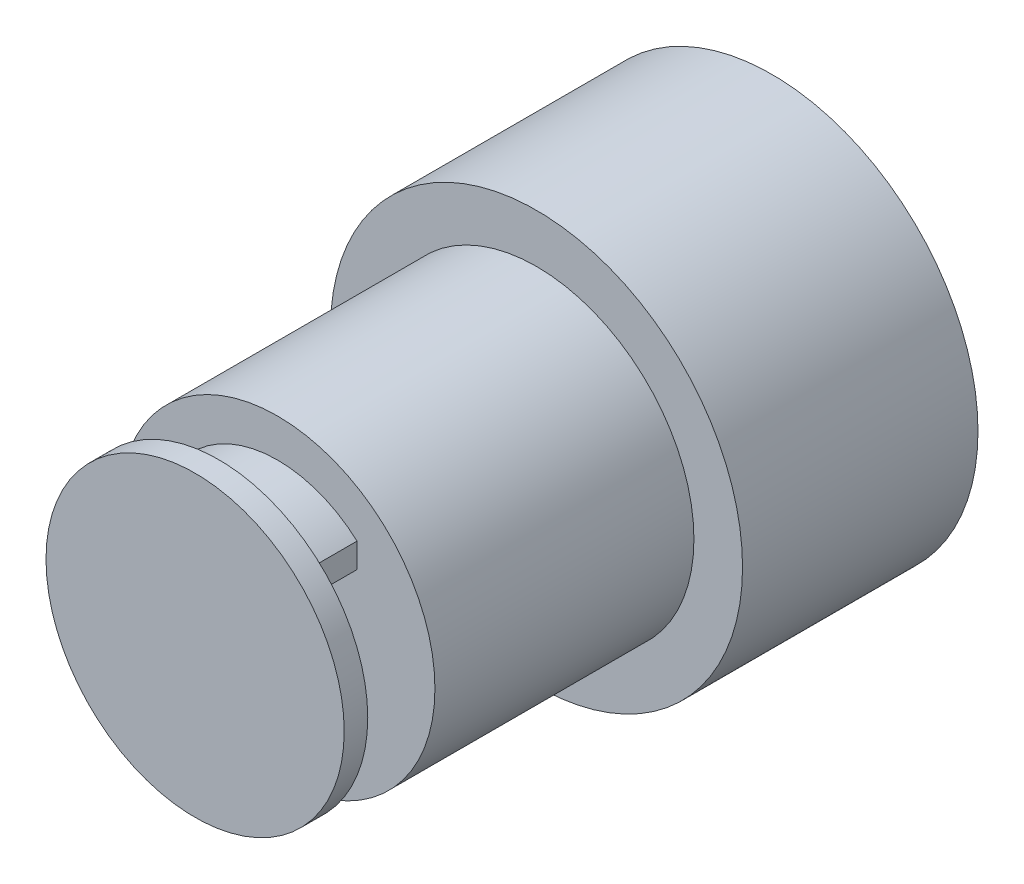
ISO-10303-21;
HEADER;
FILE_DESCRIPTION(('STEP AP214'),'2;1');
FILE_NAME('part.step','',(''),(''),'','','');
FILE_SCHEMA(('AUTOMOTIVE_DESIGN { 1 0 10303 214 1 1 1 1 }'));
ENDSEC;
DATA;
#1=APPLICATION_CONTEXT('core data for automotive mechanical design processes');
#2=APPLICATION_PROTOCOL_DEFINITION('international standard','automotive_design',2000,#1);
#3=PRODUCT_CONTEXT('',#1,'mechanical');
#4=PRODUCT('Part','Part','',(#3));
#5=PRODUCT_RELATED_PRODUCT_CATEGORY('part','',(#4));
#6=PRODUCT_DEFINITION_FORMATION('','',#4);
#7=PRODUCT_DEFINITION_CONTEXT('part definition',#1,'design');
#8=PRODUCT_DEFINITION('design','',#6,#7);
#9=PRODUCT_DEFINITION_SHAPE('','',#8);
#10=(LENGTH_UNIT() NAMED_UNIT(*) SI_UNIT(.MILLI.,.METRE.));
#11=(NAMED_UNIT(*) PLANE_ANGLE_UNIT() SI_UNIT($,.RADIAN.));
#12=(NAMED_UNIT(*) SI_UNIT($,.STERADIAN.) SOLID_ANGLE_UNIT());
#13=UNCERTAINTY_MEASURE_WITH_UNIT(LENGTH_MEASURE(1.E-05),#10,'distance_accuracy_value','');
#14=(GEOMETRIC_REPRESENTATION_CONTEXT(3) GLOBAL_UNCERTAINTY_ASSIGNED_CONTEXT((#13)) GLOBAL_UNIT_ASSIGNED_CONTEXT((#10,
#11,#12)) REPRESENTATION_CONTEXT('',''));
#15=CARTESIAN_POINT('',(0.,0.,0.));
#16=DIRECTION('',(0.,0.,1.));
#17=DIRECTION('',(1.,0.,0.));
#18=AXIS2_PLACEMENT_3D('',#15,#16,#17);
#19=CARTESIAN_POINT('',(0.,0.,0.));
#20=DIRECTION('',(0.,0.,1.));
#21=DIRECTION('',(1.,0.,0.));
#22=AXIS2_PLACEMENT_3D('',#19,#20,#21);
#23=PLANE('',#22);
#24=CARTESIAN_POINT('',(0.,0.,0.));
#25=DIRECTION('',(0.,0.,1.));
#26=DIRECTION('',(1.,0.,0.));
#27=AXIS2_PLACEMENT_3D('',#24,#25,#26);
#28=CIRCLE('',#27,17.5);
#29=CARTESIAN_POINT('',(17.5,0.,0.));
#30=VERTEX_POINT('',#29);
#31=EDGE_CURVE('E171',#30,#30,#28,.T.);
#32=ORIENTED_EDGE('',*,*,#31,.F.);
#33=EDGE_LOOP('',(#32));
#34=FACE_BOUND('',#33,.T.);
#35=CARTESIAN_POINT('',(0.,-10.,0.));
#36=DIRECTION('',(0.,0.,1.));
#37=DIRECTION('',(1.,0.,0.));
#38=AXIS2_PLACEMENT_3D('',#35,#36,#37);
#39=CIRCLE('',#38,6.);
#40=CARTESIAN_POINT('',(6.,-10.,0.));
#41=VERTEX_POINT('',#40);
#42=EDGE_CURVE('E11',#41,#41,#39,.F.);
#43=ORIENTED_EDGE('',*,*,#42,.F.);
#44=EDGE_LOOP('',(#43));
#45=FACE_BOUND('',#44,.T.);
#46=ADVANCED_FACE('F33',(#34,#45),#23,.F.);
#47=CARTESIAN_POINT('',(0.,0.,42.));
#48=DIRECTION('',(0.,0.,1.));
#49=DIRECTION('',(1.,0.,0.));
#50=AXIS2_PLACEMENT_3D('',#47,#48,#49);
#51=PLANE('',#50);
#52=CARTESIAN_POINT('',(0.,0.,42.));
#53=DIRECTION('',(0.,0.,1.));
#54=DIRECTION('',(1.,0.,0.));
#55=AXIS2_PLACEMENT_3D('',#52,#53,#54);
#56=CIRCLE('',#55,13.3711263728301);
#57=CARTESIAN_POINT('',(13.3711263728301,0.,42.));
#58=VERTEX_POINT('',#57);
#59=EDGE_CURVE('E168',#58,#58,#56,.T.);
#60=ORIENTED_EDGE('',*,*,#59,.T.);
#61=EDGE_LOOP('',(#60));
#62=FACE_BOUND('',#61,.T.);
#63=DIRECTION('',(0.,1.,0.));
#64=VECTOR('',#63,1.);
#65=CARTESIAN_POINT('',(6.75937618908056,7.54757199911484,42.));
#66=LINE('',#65,#64);
#67=CARTESIAN_POINT('',(6.75937618908056,5.45228770009301,42.));
#68=VERTEX_POINT('',#67);
#69=CARTESIAN_POINT('',(6.75937618908056,7.54757199911484,42.));
#70=VERTEX_POINT('',#69);
#71=EDGE_CURVE('E155',#68,#70,#66,.T.);
#72=ORIENTED_EDGE('',*,*,#71,.F.);
#73=CARTESIAN_POINT('',(0.,0.,42.));
#74=DIRECTION('',(0.,0.,-1.));
#75=DIRECTION('',(1.,0.,0.));
#76=AXIS2_PLACEMENT_3D('',#73,#74,#75);
#77=CIRCLE('',#76,8.68427358102534);
#78=CARTESIAN_POINT('',(-6.75937618908056,5.45228770009301,42.));
#79=VERTEX_POINT('',#78);
#80=EDGE_CURVE('E138',#79,#68,#77,.T.);
#81=ORIENTED_EDGE('',*,*,#80,.F.);
#82=DIRECTION('',(0.,-1.,0.));
#83=VECTOR('',#82,1.);
#84=CARTESIAN_POINT('',(-6.75937618908056,7.54757199911484,42.));
#85=LINE('',#84,#83);
#86=CARTESIAN_POINT('',(-6.75937618908056,7.54757199911484,42.));
#87=VERTEX_POINT('',#86);
#88=EDGE_CURVE('E143',#87,#79,#85,.T.);
#89=ORIENTED_EDGE('',*,*,#88,.F.);
#90=CARTESIAN_POINT('',(0.,0.,42.));
#91=DIRECTION('',(0.,0.,1.));
#92=DIRECTION('',(1.,0.,0.));
#93=AXIS2_PLACEMENT_3D('',#90,#91,#92);
#94=CIRCLE('',#93,10.1318808494441);
#95=EDGE_CURVE('E157',#70,#87,#94,.T.);
#96=ORIENTED_EDGE('',*,*,#95,.F.);
#97=EDGE_LOOP('',(#72,#81,#89,#96));
#98=FACE_BOUND('',#97,.T.);
#99=DIRECTION('',(0.,1.,0.));
#100=VECTOR('',#99,1.);
#101=CARTESIAN_POINT('',(6.75937618908056,-5.45228770009301,42.));
#102=LINE('',#101,#100);
#103=CARTESIAN_POINT('',(6.75937618908056,-7.54757199911484,42.));
#104=VERTEX_POINT('',#103);
#105=CARTESIAN_POINT('',(6.75937618908056,-5.45228770009301,42.));
#106=VERTEX_POINT('',#105);
#107=EDGE_CURVE('E127',#104,#106,#102,.T.);
#108=ORIENTED_EDGE('',*,*,#107,.F.);
#109=CARTESIAN_POINT('',(0.,0.,42.));
#110=DIRECTION('',(0.,0.,1.));
#111=DIRECTION('',(1.,0.,0.));
#112=AXIS2_PLACEMENT_3D('',#109,#110,#111);
#113=CIRCLE('',#112,10.1318808494441);
#114=CARTESIAN_POINT('',(-6.75937618908056,-7.54757199911484,42.));
#115=VERTEX_POINT('',#114);
#116=EDGE_CURVE('E125',#115,#104,#113,.T.);
#117=ORIENTED_EDGE('',*,*,#116,.F.);
#118=DIRECTION('',(0.,-1.,0.));
#119=VECTOR('',#118,1.);
#120=CARTESIAN_POINT('',(-6.75937618908056,-5.45228770009301,42.));
#121=LINE('',#120,#119);
#122=CARTESIAN_POINT('',(-6.75937618908056,-5.45228770009301,42.));
#123=VERTEX_POINT('',#122);
#124=EDGE_CURVE('E110',#123,#115,#121,.T.);
#125=ORIENTED_EDGE('',*,*,#124,.F.);
#126=CARTESIAN_POINT('',(0.,0.,42.));
#127=DIRECTION('',(0.,0.,-1.));
#128=DIRECTION('',(1.,0.,0.));
#129=AXIS2_PLACEMENT_3D('',#126,#127,#128);
#130=CIRCLE('',#129,8.68427358102534);
#131=EDGE_CURVE('E130',#106,#123,#130,.T.);
#132=ORIENTED_EDGE('',*,*,#131,.F.);
#133=EDGE_LOOP('',(#108,#117,#125,#132));
#134=FACE_BOUND('',#133,.T.);
#135=ADVANCED_FACE('F182',(#62,#98,#134),#51,.T.);
#136=CARTESIAN_POINT('',(0.,0.,20.));
#137=DIRECTION('',(0.,0.,-1.));
#138=DIRECTION('',(-1.,0.,0.));
#139=AXIS2_PLACEMENT_3D('',#136,#137,#138);
#140=CYLINDRICAL_SURFACE('',#139,17.5);
#141=CARTESIAN_POINT('',(0.,0.,20.));
#142=DIRECTION('',(0.,0.,1.));
#143=DIRECTION('',(1.,0.,0.));
#144=AXIS2_PLACEMENT_3D('',#141,#142,#143);
#145=CIRCLE('',#144,17.5);
#146=CARTESIAN_POINT('',(17.5,0.,20.));
#147=VERTEX_POINT('',#146);
#148=EDGE_CURVE('E174',#147,#147,#145,.T.);
#149=ORIENTED_EDGE('',*,*,#148,.F.);
#150=EDGE_LOOP('',(#149));
#151=FACE_BOUND('',#150,.T.);
#152=ORIENTED_EDGE('',*,*,#31,.T.);
#153=EDGE_LOOP('',(#152));
#154=FACE_BOUND('',#153,.T.);
#155=ADVANCED_FACE('F35',(#151,#154),#140,.T.);
#156=CARTESIAN_POINT('',(0.,0.,20.));
#157=DIRECTION('',(0.,0.,1.));
#158=DIRECTION('',(1.,0.,0.));
#159=AXIS2_PLACEMENT_3D('',#156,#157,#158);
#160=PLANE('',#159);
#161=CARTESIAN_POINT('',(0.,0.,20.));
#162=DIRECTION('',(0.,0.,1.));
#163=DIRECTION('',(1.,0.,0.));
#164=AXIS2_PLACEMENT_3D('',#161,#162,#163);
#165=CIRCLE('',#164,13.3711263728301);
#166=CARTESIAN_POINT('',(13.3711263728301,0.,20.));
#167=VERTEX_POINT('',#166);
#168=EDGE_CURVE('E41',#167,#167,#165,.T.);
#169=ORIENTED_EDGE('',*,*,#168,.F.);
#170=EDGE_LOOP('',(#169));
#171=FACE_BOUND('',#170,.T.);
#172=ORIENTED_EDGE('',*,*,#148,.T.);
#173=EDGE_LOOP('',(#172));
#174=FACE_BOUND('',#173,.T.);
#175=ADVANCED_FACE('F246',(#171,#174),#160,.T.);
#176=CARTESIAN_POINT('',(0.,0.,42.));
#177=DIRECTION('',(0.,0.,-1.));
#178=DIRECTION('',(-1.,0.,0.));
#179=AXIS2_PLACEMENT_3D('',#176,#177,#178);
#180=CYLINDRICAL_SURFACE('',#179,13.3711263728301);
#181=ORIENTED_EDGE('',*,*,#59,.F.);
#182=EDGE_LOOP('',(#181));
#183=FACE_BOUND('',#182,.T.);
#184=ORIENTED_EDGE('',*,*,#168,.T.);
#185=EDGE_LOOP('',(#184));
#186=FACE_BOUND('',#185,.T.);
#187=ADVANCED_FACE('F239',(#183,#186),#180,.T.);
#188=CARTESIAN_POINT('',(0.,0.,47.));
#189=DIRECTION('',(0.,0.,-1.));
#190=DIRECTION('',(-1.,0.,0.));
#191=AXIS2_PLACEMENT_3D('',#188,#189,#190);
#192=CYLINDRICAL_SURFACE('',#191,8.68427358102534);
#193=ORIENTED_EDGE('',*,*,#80,.T.);
#194=DIRECTION('',(0.,0.,-1.));
#195=VECTOR('',#194,1.);
#196=CARTESIAN_POINT('',(6.75937618908056,5.45228770009301,47.));
#197=LINE('',#196,#195);
#198=CARTESIAN_POINT('',(6.75937618908056,5.45228770009301,47.));
#199=VERTEX_POINT('',#198);
#200=EDGE_CURVE('E166',#199,#68,#197,.T.);
#201=ORIENTED_EDGE('',*,*,#200,.F.);
#202=CARTESIAN_POINT('',(0.,0.,47.));
#203=DIRECTION('',(0.,0.,-1.));
#204=DIRECTION('',(1.,0.,0.));
#205=AXIS2_PLACEMENT_3D('',#202,#203,#204);
#206=CIRCLE('',#205,8.68427358102534);
#207=CARTESIAN_POINT('',(-6.75937618908056,5.45228770009301,47.));
#208=VERTEX_POINT('',#207);
#209=EDGE_CURVE('E139',#208,#199,#206,.T.);
#210=ORIENTED_EDGE('',*,*,#209,.F.);
#211=DIRECTION('',(0.,0.,-1.));
#212=VECTOR('',#211,1.);
#213=CARTESIAN_POINT('',(-6.75937618908056,5.45228770009301,47.));
#214=LINE('',#213,#212);
#215=EDGE_CURVE('E152',#208,#79,#214,.T.);
#216=ORIENTED_EDGE('',*,*,#215,.T.);
#217=EDGE_LOOP('',(#193,#201,#210,#216));
#218=FACE_BOUND('',#217,.T.);
#219=ADVANCED_FACE('F235',(#218),#192,.F.);
#220=CARTESIAN_POINT('',(6.75937618908056,7.54757199911484,47.));
#221=DIRECTION('',(-1.,0.,0.));
#222=DIRECTION('',(0.,0.,1.));
#223=AXIS2_PLACEMENT_3D('',#220,#221,#222);
#224=PLANE('',#223);
#225=ORIENTED_EDGE('',*,*,#71,.T.);
#226=DIRECTION('',(0.,0.,-1.));
#227=VECTOR('',#226,1.);
#228=CARTESIAN_POINT('',(6.75937618908056,7.54757199911484,47.));
#229=LINE('',#228,#227);
#230=CARTESIAN_POINT('',(6.75937618908056,7.54757199911484,47.));
#231=VERTEX_POINT('',#230);
#232=EDGE_CURVE('E163',#231,#70,#229,.T.);
#233=ORIENTED_EDGE('',*,*,#232,.F.);
#234=DIRECTION('',(0.,1.,0.));
#235=VECTOR('',#234,1.);
#236=CARTESIAN_POINT('',(6.75937618908056,7.54757199911484,47.));
#237=LINE('',#236,#235);
#238=EDGE_CURVE('E142',#199,#231,#237,.T.);
#239=ORIENTED_EDGE('',*,*,#238,.F.);
#240=ORIENTED_EDGE('',*,*,#200,.T.);
#241=EDGE_LOOP('',(#225,#233,#239,#240));
#242=FACE_BOUND('',#241,.T.);
#243=ADVANCED_FACE('F231',(#242),#224,.F.);
#244=CARTESIAN_POINT('',(0.,0.,47.));
#245=DIRECTION('',(0.,0.,-1.));
#246=DIRECTION('',(-1.,0.,0.));
#247=AXIS2_PLACEMENT_3D('',#244,#245,#246);
#248=CYLINDRICAL_SURFACE('',#247,10.1318808494441);
#249=ORIENTED_EDGE('',*,*,#95,.T.);
#250=DIRECTION('',(0.,0.,-1.));
#251=VECTOR('',#250,1.);
#252=CARTESIAN_POINT('',(-6.75937618908056,7.54757199911484,47.));
#253=LINE('',#252,#251);
#254=CARTESIAN_POINT('',(-6.75937618908056,7.54757199911484,47.));
#255=VERTEX_POINT('',#254);
#256=EDGE_CURVE('E56',#255,#87,#253,.T.);
#257=ORIENTED_EDGE('',*,*,#256,.F.);
#258=CARTESIAN_POINT('',(0.,0.,47.));
#259=DIRECTION('',(0.,0.,1.));
#260=DIRECTION('',(1.,0.,0.));
#261=AXIS2_PLACEMENT_3D('',#258,#259,#260);
#262=CIRCLE('',#261,10.1318808494441);
#263=EDGE_CURVE('E146',#231,#255,#262,.T.);
#264=ORIENTED_EDGE('',*,*,#263,.F.);
#265=ORIENTED_EDGE('',*,*,#232,.T.);
#266=EDGE_LOOP('',(#249,#257,#264,#265));
#267=FACE_BOUND('',#266,.T.);
#268=ADVANCED_FACE('F228',(#267),#248,.T.);
#269=CARTESIAN_POINT('',(-6.75937618908056,7.54757199911484,47.));
#270=DIRECTION('',(1.,0.,0.));
#271=DIRECTION('',(0.,0.,-1.));
#272=AXIS2_PLACEMENT_3D('',#269,#270,#271);
#273=PLANE('',#272);
#274=ORIENTED_EDGE('',*,*,#88,.T.);
#275=ORIENTED_EDGE('',*,*,#215,.F.);
#276=DIRECTION('',(0.,-1.,0.));
#277=VECTOR('',#276,1.);
#278=CARTESIAN_POINT('',(-6.75937618908056,7.54757199911484,47.));
#279=LINE('',#278,#277);
#280=EDGE_CURVE('E149',#255,#208,#279,.T.);
#281=ORIENTED_EDGE('',*,*,#280,.F.);
#282=ORIENTED_EDGE('',*,*,#256,.T.);
#283=EDGE_LOOP('',(#274,#275,#281,#282));
#284=FACE_BOUND('',#283,.T.);
#285=ADVANCED_FACE('F225',(#284),#273,.F.);
#286=CARTESIAN_POINT('',(0.,0.,47.));
#287=DIRECTION('',(0.,0.,-1.));
#288=DIRECTION('',(-1.,0.,0.));
#289=AXIS2_PLACEMENT_3D('',#286,#287,#288);
#290=CYLINDRICAL_SURFACE('',#289,10.1318808494441);
#291=ORIENTED_EDGE('',*,*,#116,.T.);
#292=DIRECTION('',(0.,0.,-1.));
#293=VECTOR('',#292,1.);
#294=CARTESIAN_POINT('',(6.75937618908056,-7.54757199911484,47.));
#295=LINE('',#294,#293);
#296=CARTESIAN_POINT('',(6.75937618908056,-7.54757199911484,47.));
#297=VERTEX_POINT('',#296);
#298=EDGE_CURVE('E105',#297,#104,#295,.T.);
#299=ORIENTED_EDGE('',*,*,#298,.F.);
#300=CARTESIAN_POINT('',(0.,0.,47.));
#301=DIRECTION('',(0.,0.,1.));
#302=DIRECTION('',(1.,0.,0.));
#303=AXIS2_PLACEMENT_3D('',#300,#301,#302);
#304=CIRCLE('',#303,10.1318808494441);
#305=CARTESIAN_POINT('',(-6.75937618908056,-7.54757199911484,47.));
#306=VERTEX_POINT('',#305);
#307=EDGE_CURVE('E99',#306,#297,#304,.T.);
#308=ORIENTED_EDGE('',*,*,#307,.F.);
#309=DIRECTION('',(0.,0.,-1.));
#310=VECTOR('',#309,1.);
#311=CARTESIAN_POINT('',(-6.75937618908056,-7.54757199911484,47.));
#312=LINE('',#311,#310);
#313=EDGE_CURVE('E103',#306,#115,#312,.T.);
#314=ORIENTED_EDGE('',*,*,#313,.T.);
#315=EDGE_LOOP('',(#291,#299,#308,#314));
#316=FACE_BOUND('',#315,.T.);
#317=ADVANCED_FACE('F102',(#316),#290,.T.);
#318=CARTESIAN_POINT('',(6.75937618908056,-5.45228770009301,47.));
#319=DIRECTION('',(-1.,0.,0.));
#320=DIRECTION('',(0.,0.,1.));
#321=AXIS2_PLACEMENT_3D('',#318,#319,#320);
#322=PLANE('',#321);
#323=ORIENTED_EDGE('',*,*,#107,.T.);
#324=DIRECTION('',(0.,0.,-1.));
#325=VECTOR('',#324,1.);
#326=CARTESIAN_POINT('',(6.75937618908056,-5.45228770009301,47.));
#327=LINE('',#326,#325);
#328=CARTESIAN_POINT('',(6.75937618908056,-5.45228770009301,47.));
#329=VERTEX_POINT('',#328);
#330=EDGE_CURVE('E134',#329,#106,#327,.T.);
#331=ORIENTED_EDGE('',*,*,#330,.F.);
#332=DIRECTION('',(0.,1.,0.));
#333=VECTOR('',#332,1.);
#334=CARTESIAN_POINT('',(6.75937618908056,-5.45228770009301,47.));
#335=LINE('',#334,#333);
#336=EDGE_CURVE('E109',#297,#329,#335,.T.);
#337=ORIENTED_EDGE('',*,*,#336,.F.);
#338=ORIENTED_EDGE('',*,*,#298,.T.);
#339=EDGE_LOOP('',(#323,#331,#337,#338));
#340=FACE_BOUND('',#339,.T.);
#341=ADVANCED_FACE('F218',(#340),#322,.F.);
#342=CARTESIAN_POINT('',(0.,0.,47.));
#343=DIRECTION('',(0.,0.,-1.));
#344=DIRECTION('',(-1.,0.,0.));
#345=AXIS2_PLACEMENT_3D('',#342,#343,#344);
#346=CYLINDRICAL_SURFACE('',#345,8.68427358102534);
#347=ORIENTED_EDGE('',*,*,#131,.T.);
#348=DIRECTION('',(0.,0.,-1.));
#349=VECTOR('',#348,1.);
#350=CARTESIAN_POINT('',(-6.75937618908056,-5.45228770009301,47.));
#351=LINE('',#350,#349);
#352=CARTESIAN_POINT('',(-6.75937618908056,-5.45228770009301,47.));
#353=VERTEX_POINT('',#352);
#354=EDGE_CURVE('E48',#353,#123,#351,.T.);
#355=ORIENTED_EDGE('',*,*,#354,.F.);
#356=CARTESIAN_POINT('',(0.,0.,47.));
#357=DIRECTION('',(0.,0.,-1.));
#358=DIRECTION('',(1.,0.,0.));
#359=AXIS2_PLACEMENT_3D('',#356,#357,#358);
#360=CIRCLE('',#359,8.68427358102534);
#361=EDGE_CURVE('E120',#329,#353,#360,.T.);
#362=ORIENTED_EDGE('',*,*,#361,.F.);
#363=ORIENTED_EDGE('',*,*,#330,.T.);
#364=EDGE_LOOP('',(#347,#355,#362,#363));
#365=FACE_BOUND('',#364,.T.);
#366=ADVANCED_FACE('F215',(#365),#346,.F.);
#367=CARTESIAN_POINT('',(-6.75937618908056,-5.45228770009301,47.));
#368=DIRECTION('',(1.,0.,0.));
#369=DIRECTION('',(0.,0.,-1.));
#370=AXIS2_PLACEMENT_3D('',#367,#368,#369);
#371=PLANE('',#370);
#372=ORIENTED_EDGE('',*,*,#124,.T.);
#373=ORIENTED_EDGE('',*,*,#313,.F.);
#374=DIRECTION('',(0.,-1.,0.));
#375=VECTOR('',#374,1.);
#376=CARTESIAN_POINT('',(-6.75937618908056,-5.45228770009301,47.));
#377=LINE('',#376,#375);
#378=EDGE_CURVE('E113',#353,#306,#377,.T.);
#379=ORIENTED_EDGE('',*,*,#378,.F.);
#380=ORIENTED_EDGE('',*,*,#354,.T.);
#381=EDGE_LOOP('',(#372,#373,#379,#380));
#382=FACE_BOUND('',#381,.T.);
#383=ADVANCED_FACE('F112',(#382),#371,.F.);
#384=CARTESIAN_POINT('',(0.,0.,47.));
#385=DIRECTION('',(0.,0.,1.));
#386=DIRECTION('',(1.,0.,0.));
#387=AXIS2_PLACEMENT_3D('',#384,#385,#386);
#388=PLANE('',#387);
#389=CARTESIAN_POINT('',(0.,0.,47.));
#390=DIRECTION('',(0.,0.,1.));
#391=DIRECTION('',(1.,0.,0.));
#392=AXIS2_PLACEMENT_3D('',#389,#390,#391);
#393=CIRCLE('',#392,12.6650001370327);
#394=CARTESIAN_POINT('',(12.6650001370327,0.,47.));
#395=VERTEX_POINT('',#394);
#396=EDGE_CURVE('E315',#395,#395,#393,.T.);
#397=ORIENTED_EDGE('',*,*,#396,.F.);
#398=EDGE_LOOP('',(#397));
#399=FACE_BOUND('',#398,.T.);
#400=ORIENTED_EDGE('',*,*,#378,.T.);
#401=ORIENTED_EDGE('',*,*,#307,.T.);
#402=ORIENTED_EDGE('',*,*,#336,.T.);
#403=ORIENTED_EDGE('',*,*,#361,.T.);
#404=EDGE_LOOP('',(#400,#401,#402,#403));
#405=FACE_BOUND('',#404,.T.);
#406=ORIENTED_EDGE('',*,*,#280,.T.);
#407=ORIENTED_EDGE('',*,*,#209,.T.);
#408=ORIENTED_EDGE('',*,*,#238,.T.);
#409=ORIENTED_EDGE('',*,*,#263,.T.);
#410=EDGE_LOOP('',(#406,#407,#408,#409));
#411=FACE_BOUND('',#410,.T.);
#412=ADVANCED_FACE('F117',(#399,#405,#411),#388,.F.);
#413=CARTESIAN_POINT('',(0.,0.,49.));
#414=DIRECTION('',(0.,0.,-1.));
#415=DIRECTION('',(-1.,0.,0.));
#416=AXIS2_PLACEMENT_3D('',#413,#414,#415);
#417=CYLINDRICAL_SURFACE('',#416,12.6650001370327);
#418=CARTESIAN_POINT('',(0.,0.,49.));
#419=DIRECTION('',(0.,0.,1.));
#420=DIRECTION('',(1.,0.,0.));
#421=AXIS2_PLACEMENT_3D('',#418,#419,#420);
#422=CIRCLE('',#421,12.6650001370327);
#423=CARTESIAN_POINT('',(12.6650001370327,0.,49.));
#424=VERTEX_POINT('',#423);
#425=EDGE_CURVE('E128',#424,#424,#422,.T.);
#426=ORIENTED_EDGE('',*,*,#425,.F.);
#427=EDGE_LOOP('',(#426));
#428=FACE_BOUND('',#427,.T.);
#429=ORIENTED_EDGE('',*,*,#396,.T.);
#430=EDGE_LOOP('',(#429));
#431=FACE_BOUND('',#430,.T.);
#432=ADVANCED_FACE('F205',(#428,#431),#417,.T.);
#433=CARTESIAN_POINT('',(0.,0.,49.));
#434=DIRECTION('',(0.,0.,1.));
#435=DIRECTION('',(1.,0.,0.));
#436=AXIS2_PLACEMENT_3D('',#433,#434,#435);
#437=PLANE('',#436);
#438=ORIENTED_EDGE('',*,*,#425,.T.);
#439=EDGE_LOOP('',(#438));
#440=FACE_BOUND('',#439,.T.);
#441=ADVANCED_FACE('F198',(#440),#437,.T.);
#442=CARTESIAN_POINT('',(0.,-10.,-4.));
#443=DIRECTION('',(0.,0.,-1.));
#444=DIRECTION('',(-1.,0.,0.));
#445=AXIS2_PLACEMENT_3D('',#442,#443,#444);
#446=PLANE('',#445);
#447=CARTESIAN_POINT('',(0.,-10.,-4.));
#448=DIRECTION('',(0.,0.,-1.));
#449=DIRECTION('',(-1.,0.,0.));
#450=AXIS2_PLACEMENT_3D('',#447,#448,#449);
#451=CIRCLE('',#450,6.);
#452=CARTESIAN_POINT('',(-6.,-10.,-4.));
#453=VERTEX_POINT('',#452);
#454=EDGE_CURVE('E310',#453,#453,#451,.T.);
#455=ORIENTED_EDGE('',*,*,#454,.T.);
#456=EDGE_LOOP('',(#455));
#457=FACE_BOUND('',#456,.T.);
#458=CARTESIAN_POINT('',(0.,-10.,-4.));
#459=DIRECTION('',(0.,0.,-1.));
#460=DIRECTION('',(-1.,0.,0.));
#461=AXIS2_PLACEMENT_3D('',#458,#459,#460);
#462=CIRCLE('',#461,2.5);
#463=CARTESIAN_POINT('',(-2.5,-10.,-4.));
#464=VERTEX_POINT('',#463);
#465=EDGE_CURVE('E307',#464,#464,#462,.T.);
#466=ORIENTED_EDGE('',*,*,#465,.F.);
#467=EDGE_LOOP('',(#466));
#468=FACE_BOUND('',#467,.T.);
#469=ADVANCED_FACE('F188',(#457,#468),#446,.T.);
#470=CARTESIAN_POINT('',(0.,-10.,-4.));
#471=DIRECTION('',(0.,0.,1.));
#472=DIRECTION('',(1.,0.,0.));
#473=AXIS2_PLACEMENT_3D('',#470,#471,#472);
#474=CYLINDRICAL_SURFACE('',#473,6.);
#475=ORIENTED_EDGE('',*,*,#454,.F.);
#476=EDGE_LOOP('',(#475));
#477=FACE_BOUND('',#476,.T.);
#478=ORIENTED_EDGE('',*,*,#42,.T.);
#479=EDGE_LOOP('',(#478));
#480=FACE_BOUND('',#479,.T.);
#481=ADVANCED_FACE('F185',(#477,#480),#474,.T.);
#482=CARTESIAN_POINT('',(0.,-10.,5.));
#483=DIRECTION('',(0.,0.,-1.));
#484=DIRECTION('',(-1.,0.,0.));
#485=AXIS2_PLACEMENT_3D('',#482,#483,#484);
#486=CYLINDRICAL_SURFACE('',#485,2.5);
#487=ORIENTED_EDGE('',*,*,#465,.T.);
#488=EDGE_LOOP('',(#487));
#489=FACE_BOUND('',#488,.T.);
#490=CARTESIAN_POINT('',(0.,-10.,5.));
#491=DIRECTION('',(0.,0.,-1.));
#492=DIRECTION('',(-1.,0.,0.));
#493=AXIS2_PLACEMENT_3D('',#490,#491,#492);
#494=CIRCLE('',#493,2.5);
#495=CARTESIAN_POINT('',(-2.5,-10.,5.));
#496=VERTEX_POINT('',#495);
#497=EDGE_CURVE('E305',#496,#496,#494,.T.);
#498=ORIENTED_EDGE('',*,*,#497,.F.);
#499=EDGE_LOOP('',(#498));
#500=FACE_BOUND('',#499,.T.);
#501=ADVANCED_FACE('F187',(#489,#500),#486,.F.);
#502=CARTESIAN_POINT('',(0.,-10.,5.));
#503=DIRECTION('',(0.,0.,-1.));
#504=DIRECTION('',(-1.,0.,0.));
#505=AXIS2_PLACEMENT_3D('',#502,#503,#504);
#506=PLANE('',#505);
#507=ORIENTED_EDGE('',*,*,#497,.T.);
#508=EDGE_LOOP('',(#507));
#509=FACE_BOUND('',#508,.T.);
#510=ADVANCED_FACE('F195',(#509),#506,.T.);
#511=CLOSED_SHELL('',(#46,#135,#155,#175,#187,#219,#243,#268,#285,#317,#341,#366,#383,#412,#432,
#441,#469,#481,#501,#510));
#512=MANIFOLD_SOLID_BREP('B2',#511);
#513=ADVANCED_BREP_SHAPE_REPRESENTATION('',(#18,#512),#14);
#514=SHAPE_DEFINITION_REPRESENTATION(#9,#513);
ENDSEC;
END-ISO-10303-21;
